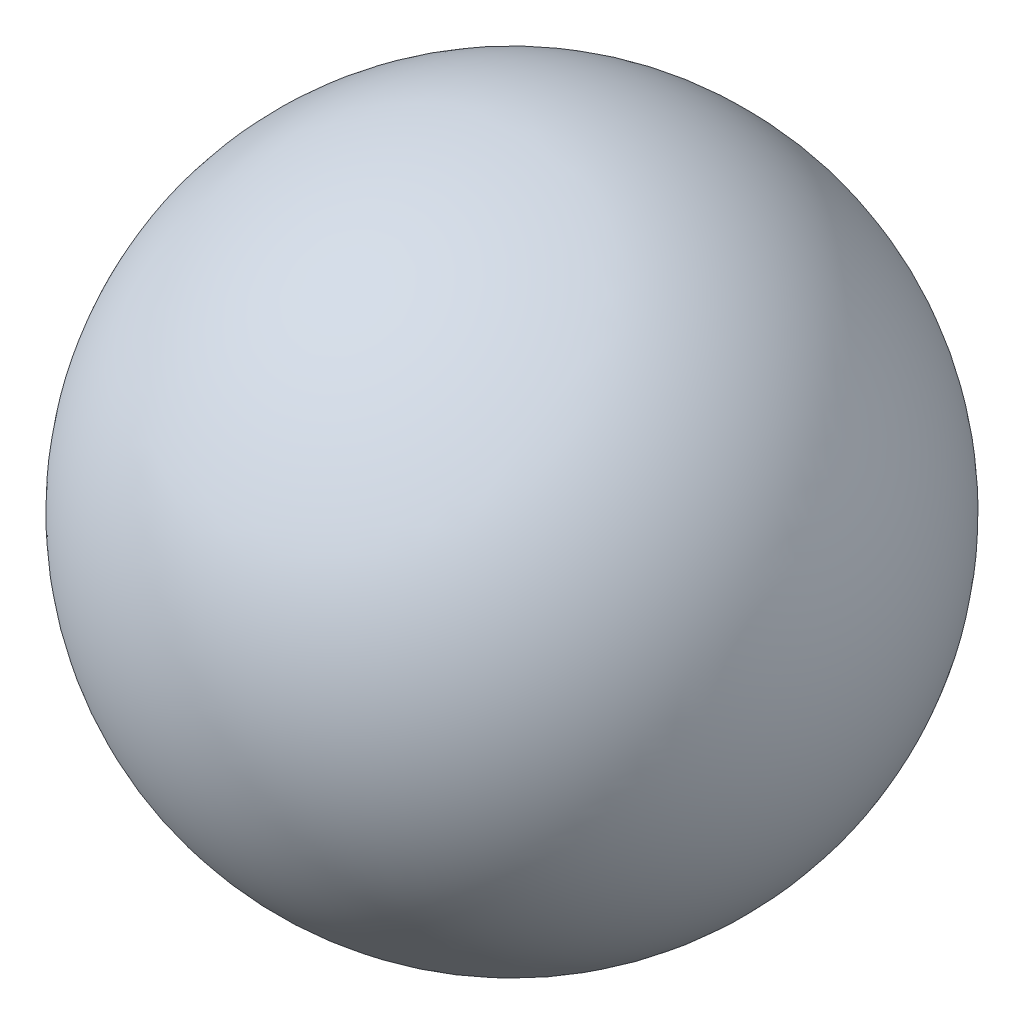
ISO-10303-21;
HEADER;
FILE_DESCRIPTION(('STEP AP214'),'2;1');
FILE_NAME('part.step','',(''),(''),'','','');
FILE_SCHEMA(('AUTOMOTIVE_DESIGN { 1 0 10303 214 1 1 1 1 }'));
ENDSEC;
DATA;
#1=APPLICATION_CONTEXT('core data for automotive mechanical design processes');
#2=APPLICATION_PROTOCOL_DEFINITION('international standard','automotive_design',2000,#1);
#3=PRODUCT_CONTEXT('',#1,'mechanical');
#4=PRODUCT('Part','Part','',(#3));
#5=PRODUCT_RELATED_PRODUCT_CATEGORY('part','',(#4));
#6=PRODUCT_DEFINITION_FORMATION('','',#4);
#7=PRODUCT_DEFINITION_CONTEXT('part definition',#1,'design');
#8=PRODUCT_DEFINITION('design','',#6,#7);
#9=PRODUCT_DEFINITION_SHAPE('','',#8);
#10=(LENGTH_UNIT() NAMED_UNIT(*) SI_UNIT(.MILLI.,.METRE.));
#11=(NAMED_UNIT(*) PLANE_ANGLE_UNIT() SI_UNIT($,.RADIAN.));
#12=(NAMED_UNIT(*) SI_UNIT($,.STERADIAN.) SOLID_ANGLE_UNIT());
#13=UNCERTAINTY_MEASURE_WITH_UNIT(LENGTH_MEASURE(1.E-05),#10,'distance_accuracy_value','');
#14=(GEOMETRIC_REPRESENTATION_CONTEXT(3) GLOBAL_UNCERTAINTY_ASSIGNED_CONTEXT((#13)) GLOBAL_UNIT_ASSIGNED_CONTEXT((#10,
#11,#12)) REPRESENTATION_CONTEXT('',''));
#15=CARTESIAN_POINT('',(0.,0.,0.));
#16=DIRECTION('',(0.,0.,1.));
#17=DIRECTION('',(1.,0.,0.));
#18=AXIS2_PLACEMENT_3D('',#15,#16,#17);
#19=CARTESIAN_POINT('',(0.,0.,0.));
#20=DIRECTION('',(-1.,0.,0.));
#21=DIRECTION('',(0.,1.,0.));
#22=AXIS2_PLACEMENT_3D('',#19,#20,#21);
#23=SPHERICAL_SURFACE('',#22,6.35);
#24=CARTESIAN_POINT('',(-6.35,0.,0.));
#25=VERTEX_POINT('',#24);
#26=VERTEX_LOOP('',#25);
#27=FACE_BOUND('',#26,.T.);
#28=ADVANCED_FACE('F29',(#27),#23,.T.);
#29=CLOSED_SHELL('',(#28));
#30=MANIFOLD_SOLID_BREP('B2',#29);
#31=ADVANCED_BREP_SHAPE_REPRESENTATION('',(#18,#30),#14);
#32=SHAPE_DEFINITION_REPRESENTATION(#9,#31);
ENDSEC;
END-ISO-10303-21;
